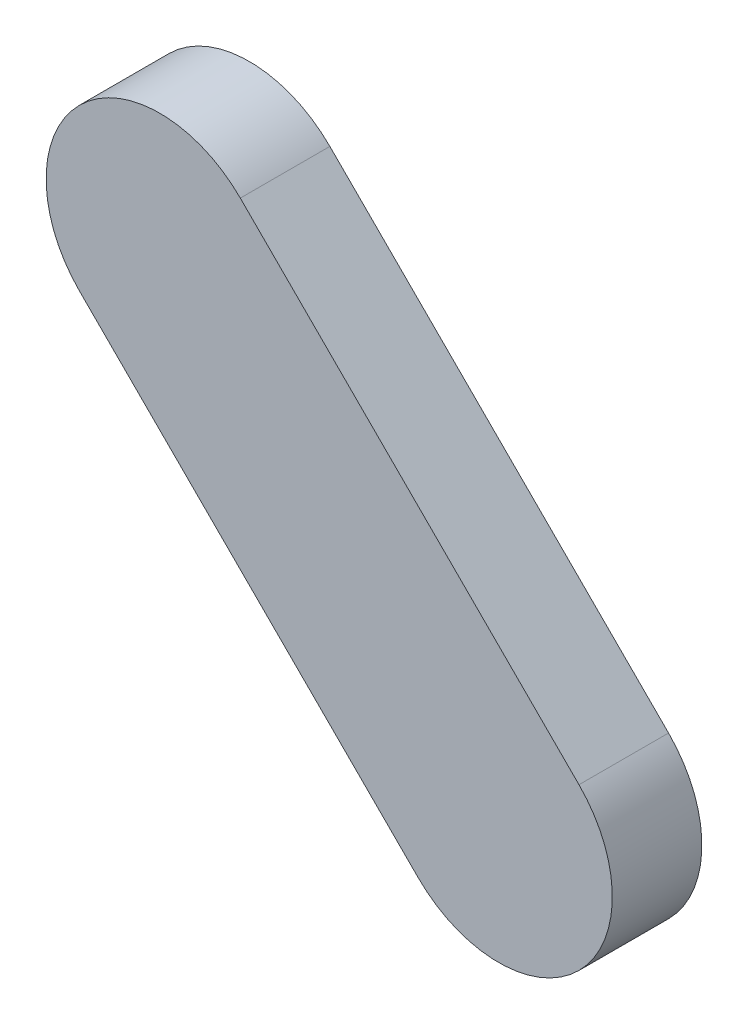
ISO-10303-21;
HEADER;
FILE_DESCRIPTION(('STEP AP214'),'2;1');
FILE_NAME('part.step','',(''),(''),'','','');
FILE_SCHEMA(('AUTOMOTIVE_DESIGN { 1 0 10303 214 1 1 1 1 }'));
ENDSEC;
DATA;
#1=APPLICATION_CONTEXT('core data for automotive mechanical design processes');
#2=APPLICATION_PROTOCOL_DEFINITION('international standard','automotive_design',2000,#1);
#3=PRODUCT_CONTEXT('',#1,'mechanical');
#4=PRODUCT('Part','Part','',(#3));
#5=PRODUCT_RELATED_PRODUCT_CATEGORY('part','',(#4));
#6=PRODUCT_DEFINITION_FORMATION('','',#4);
#7=PRODUCT_DEFINITION_CONTEXT('part definition',#1,'design');
#8=PRODUCT_DEFINITION('design','',#6,#7);
#9=PRODUCT_DEFINITION_SHAPE('','',#8);
#10=(LENGTH_UNIT() NAMED_UNIT(*) SI_UNIT(.MILLI.,.METRE.));
#11=(NAMED_UNIT(*) PLANE_ANGLE_UNIT() SI_UNIT($,.RADIAN.));
#12=(NAMED_UNIT(*) SI_UNIT($,.STERADIAN.) SOLID_ANGLE_UNIT());
#13=UNCERTAINTY_MEASURE_WITH_UNIT(LENGTH_MEASURE(1.E-05),#10,'distance_accuracy_value','');
#14=(GEOMETRIC_REPRESENTATION_CONTEXT(3) GLOBAL_UNCERTAINTY_ASSIGNED_CONTEXT((#13)) GLOBAL_UNIT_ASSIGNED_CONTEXT((#10,
#11,#12)) REPRESENTATION_CONTEXT('',''));
#15=CARTESIAN_POINT('',(0.,0.,0.));
#16=DIRECTION('',(0.,0.,1.));
#17=DIRECTION('',(1.,0.,0.));
#18=AXIS2_PLACEMENT_3D('',#15,#16,#17);
#19=CARTESIAN_POINT('',(150.13759406,83.44821766,0.));
#20=DIRECTION('',(0.707106781186554,0.707106781186541,0.));
#21=DIRECTION('',(0.707106781186541,-0.707106781186554,0.));
#22=AXIS2_PLACEMENT_3D('',#19,#20,#21);
#23=PLANE('',#22);
#24=DIRECTION('',(0.707106781186541,-0.707106781186554,0.));
#25=VECTOR('',#24,1.);
#26=CARTESIAN_POINT('',(150.13759406,83.44821766,0.1999996));
#27=LINE('',#26,#25);
#28=CARTESIAN_POINT('',(150.13759406,83.44821766,0.1999996));
#29=VERTEX_POINT('',#28);
#30=CARTESIAN_POINT('',(150.89390446,82.69190726,0.1999996));
#31=VERTEX_POINT('',#30);
#32=EDGE_CURVE('E11',#29,#31,#27,.T.);
#33=ORIENTED_EDGE('',*,*,#32,.F.);
#34=DIRECTION('',(0.,0.,1.));
#35=VECTOR('',#34,1.);
#36=CARTESIAN_POINT('',(150.13759406,83.44821766,0.));
#37=LINE('',#36,#35);
#38=CARTESIAN_POINT('',(150.13759406,83.44821766,0.));
#39=VERTEX_POINT('',#38);
#40=EDGE_CURVE('E24',#39,#29,#37,.T.);
#41=ORIENTED_EDGE('',*,*,#40,.F.);
#42=DIRECTION('',(0.707106781186541,-0.707106781186554,0.));
#43=VECTOR('',#42,1.);
#44=CARTESIAN_POINT('',(150.13759406,83.44821766,0.));
#45=LINE('',#44,#43);
#46=CARTESIAN_POINT('',(150.89390446,82.69190726,0.));
#47=VERTEX_POINT('',#46);
#48=EDGE_CURVE('E75',#39,#47,#45,.T.);
#49=ORIENTED_EDGE('',*,*,#48,.T.);
#50=DIRECTION('',(0.,0.,1.));
#51=VECTOR('',#50,1.);
#52=CARTESIAN_POINT('',(150.89390446,82.69190726,0.));
#53=LINE('',#52,#51);
#54=EDGE_CURVE('E37',#47,#31,#53,.T.);
#55=ORIENTED_EDGE('',*,*,#54,.T.);
#56=EDGE_LOOP('',(#33,#41,#49,#55));
#57=FACE_BOUND('',#56,.T.);
#58=ADVANCED_FACE('F17',(#57),#23,.F.);
#59=CARTESIAN_POINT('',(151.0735104,82.8715132,0.));
#60=DIRECTION('',(0.,0.,-1.));
#61=DIRECTION('',(-0.70710678118652,-0.707106781186576,0.));
#62=AXIS2_PLACEMENT_3D('',#59,#60,#61);
#63=CYLINDRICAL_SURFACE('',#62,0.254001156230774);
#64=CARTESIAN_POINT('',(151.0735104,82.8715132,0.1999996));
#65=DIRECTION('',(0.,0.,1.));
#66=DIRECTION('',(-0.70710678118652,-0.707106781186576,0.));
#67=AXIS2_PLACEMENT_3D('',#64,#65,#66);
#68=CIRCLE('',#67,0.254001156230774);
#69=CARTESIAN_POINT('',(151.25311634,83.05111914,0.1999996));
#70=VERTEX_POINT('',#69);
#71=EDGE_CURVE('E83',#31,#70,#68,.T.);
#72=ORIENTED_EDGE('',*,*,#71,.F.);
#73=ORIENTED_EDGE('',*,*,#54,.F.);
#74=CARTESIAN_POINT('',(151.0735104,82.8715132,0.));
#75=DIRECTION('',(0.,0.,1.));
#76=DIRECTION('',(-0.70710678118652,-0.707106781186576,0.));
#77=AXIS2_PLACEMENT_3D('',#74,#75,#76);
#78=CIRCLE('',#77,0.254001156230774);
#79=CARTESIAN_POINT('',(151.25311634,83.05111914,0.));
#80=VERTEX_POINT('',#79);
#81=EDGE_CURVE('E81',#47,#80,#78,.T.);
#82=ORIENTED_EDGE('',*,*,#81,.T.);
#83=DIRECTION('',(0.,0.,1.));
#84=VECTOR('',#83,1.);
#85=CARTESIAN_POINT('',(151.25311634,83.05111914,0.));
#86=LINE('',#85,#84);
#87=EDGE_CURVE('E67',#80,#70,#86,.T.);
#88=ORIENTED_EDGE('',*,*,#87,.T.);
#89=EDGE_LOOP('',(#72,#73,#82,#88));
#90=FACE_BOUND('',#89,.T.);
#91=ADVANCED_FACE('F89',(#90),#63,.T.);
#92=CARTESIAN_POINT('',(151.25311634,83.05111914,0.));
#93=DIRECTION('',(-0.707106781186554,-0.707106781186541,0.));
#94=DIRECTION('',(-0.707106781186541,0.707106781186554,0.));
#95=AXIS2_PLACEMENT_3D('',#92,#93,#94);
#96=PLANE('',#95);
#97=DIRECTION('',(-0.707106781186541,0.707106781186554,0.));
#98=VECTOR('',#97,1.);
#99=CARTESIAN_POINT('',(151.25311634,83.05111914,0.1999996));
#100=LINE('',#99,#98);
#101=CARTESIAN_POINT('',(150.49680594,83.80742954,0.1999996));
#102=VERTEX_POINT('',#101);
#103=EDGE_CURVE('E71',#70,#102,#100,.T.);
#104=ORIENTED_EDGE('',*,*,#103,.F.);
#105=ORIENTED_EDGE('',*,*,#87,.F.);
#106=DIRECTION('',(-0.707106781186541,0.707106781186554,0.));
#107=VECTOR('',#106,1.);
#108=CARTESIAN_POINT('',(151.25311634,83.05111914,0.));
#109=LINE('',#108,#107);
#110=CARTESIAN_POINT('',(150.49680594,83.80742954,0.));
#111=VERTEX_POINT('',#110);
#112=EDGE_CURVE('E63',#80,#111,#109,.T.);
#113=ORIENTED_EDGE('',*,*,#112,.T.);
#114=DIRECTION('',(0.,0.,1.));
#115=VECTOR('',#114,1.);
#116=CARTESIAN_POINT('',(150.49680594,83.80742954,0.));
#117=LINE('',#116,#115);
#118=EDGE_CURVE('E53',#111,#102,#117,.T.);
#119=ORIENTED_EDGE('',*,*,#118,.T.);
#120=EDGE_LOOP('',(#104,#105,#113,#119));
#121=FACE_BOUND('',#120,.T.);
#122=ADVANCED_FACE('F66',(#121),#96,.F.);
#123=CARTESIAN_POINT('',(150.3172,83.6278236,0.));
#124=DIRECTION('',(0.,0.,-1.));
#125=DIRECTION('',(0.70710678118652,0.707106781186576,0.));
#126=AXIS2_PLACEMENT_3D('',#123,#124,#125);
#127=CYLINDRICAL_SURFACE('',#126,0.254001156230774);
#128=CARTESIAN_POINT('',(150.3172,83.6278236,0.1999996));
#129=DIRECTION('',(0.,0.,1.));
#130=DIRECTION('',(0.70710678118652,0.707106781186576,0.));
#131=AXIS2_PLACEMENT_3D('',#128,#129,#130);
#132=CIRCLE('',#131,0.254001156230774);
#133=EDGE_CURVE('E59',#102,#29,#132,.T.);
#134=ORIENTED_EDGE('',*,*,#133,.F.);
#135=ORIENTED_EDGE('',*,*,#118,.F.);
#136=CARTESIAN_POINT('',(150.3172,83.6278236,0.));
#137=DIRECTION('',(0.,0.,1.));
#138=DIRECTION('',(0.70710678118652,0.707106781186576,0.));
#139=AXIS2_PLACEMENT_3D('',#136,#137,#138);
#140=CIRCLE('',#139,0.254001156230774);
#141=EDGE_CURVE('E57',#111,#39,#140,.T.);
#142=ORIENTED_EDGE('',*,*,#141,.T.);
#143=ORIENTED_EDGE('',*,*,#40,.T.);
#144=EDGE_LOOP('',(#134,#135,#142,#143));
#145=FACE_BOUND('',#144,.T.);
#146=ADVANCED_FACE('F55',(#145),#127,.T.);
#147=CARTESIAN_POINT('',(150.13759406,83.44821766,0.));
#148=DIRECTION('',(0.,0.,-1.));
#149=DIRECTION('',(-1.,0.,0.));
#150=AXIS2_PLACEMENT_3D('',#147,#148,#149);
#151=PLANE('',#150);
#152=ORIENTED_EDGE('',*,*,#141,.F.);
#153=ORIENTED_EDGE('',*,*,#112,.F.);
#154=ORIENTED_EDGE('',*,*,#81,.F.);
#155=ORIENTED_EDGE('',*,*,#48,.F.);
#156=EDGE_LOOP('',(#152,#153,#154,#155));
#157=FACE_BOUND('',#156,.T.);
#158=ADVANCED_FACE('F74',(#157),#151,.T.);
#159=CARTESIAN_POINT('',(150.13759406,83.44821766,0.1999996));
#160=DIRECTION('',(0.,0.,-1.));
#161=DIRECTION('',(-1.,0.,0.));
#162=AXIS2_PLACEMENT_3D('',#159,#160,#161);
#163=PLANE('',#162);
#164=ORIENTED_EDGE('',*,*,#32,.T.);
#165=ORIENTED_EDGE('',*,*,#71,.T.);
#166=ORIENTED_EDGE('',*,*,#103,.T.);
#167=ORIENTED_EDGE('',*,*,#133,.T.);
#168=EDGE_LOOP('',(#164,#165,#166,#167));
#169=FACE_BOUND('',#168,.T.);
#170=ADVANCED_FACE('F91',(#169),#163,.F.);
#171=CLOSED_SHELL('',(#58,#91,#122,#146,#158,#170));
#172=MANIFOLD_SOLID_BREP('B1',#171);
#173=ADVANCED_BREP_SHAPE_REPRESENTATION('',(#18,#172),#14);
#174=SHAPE_DEFINITION_REPRESENTATION(#9,#173);
ENDSEC;
END-ISO-10303-21;
